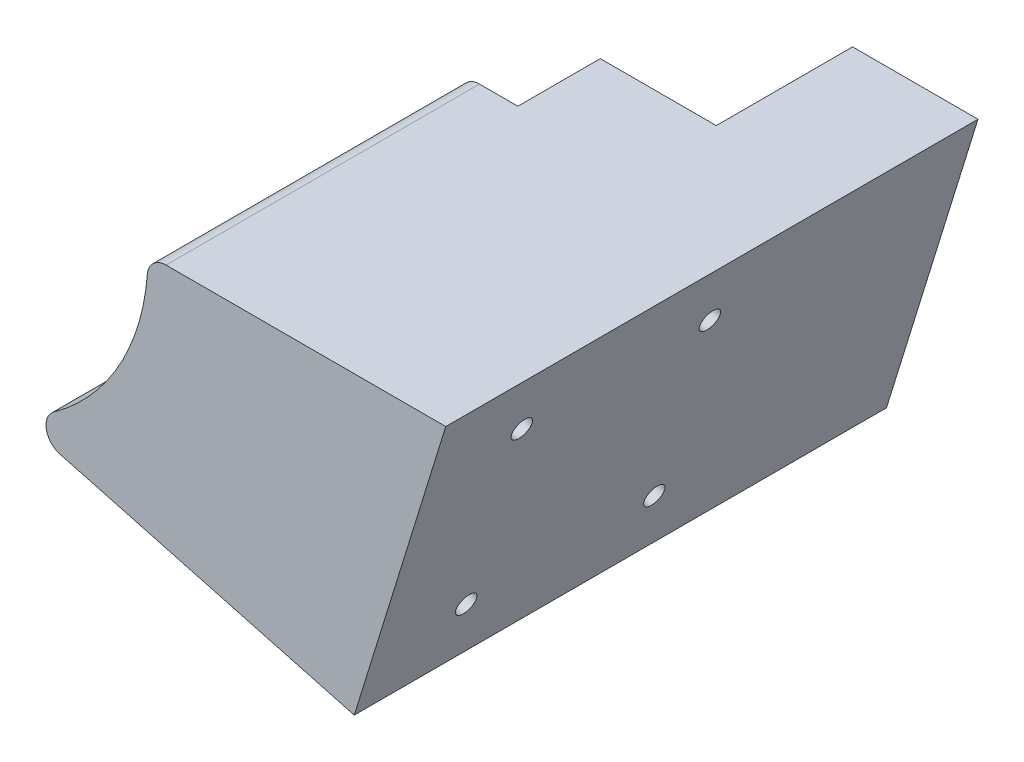
ISO-10303-21;
HEADER;
FILE_DESCRIPTION(('STEP AP214'),'2;1');
FILE_NAME('part.step','',(''),(''),'','','');
FILE_SCHEMA(('AUTOMOTIVE_DESIGN { 1 0 10303 214 1 1 1 1 }'));
ENDSEC;
DATA;
#1=APPLICATION_CONTEXT('core data for automotive mechanical design processes');
#2=APPLICATION_PROTOCOL_DEFINITION('international standard','automotive_design',2000,#1);
#3=PRODUCT_CONTEXT('',#1,'mechanical');
#4=PRODUCT('Part','Part','',(#3));
#5=PRODUCT_RELATED_PRODUCT_CATEGORY('part','',(#4));
#6=PRODUCT_DEFINITION_FORMATION('','',#4);
#7=PRODUCT_DEFINITION_CONTEXT('part definition',#1,'design');
#8=PRODUCT_DEFINITION('design','',#6,#7);
#9=PRODUCT_DEFINITION_SHAPE('','',#8);
#10=(LENGTH_UNIT() NAMED_UNIT(*) SI_UNIT(.MILLI.,.METRE.));
#11=(NAMED_UNIT(*) PLANE_ANGLE_UNIT() SI_UNIT($,.RADIAN.));
#12=(NAMED_UNIT(*) SI_UNIT($,.STERADIAN.) SOLID_ANGLE_UNIT());
#13=UNCERTAINTY_MEASURE_WITH_UNIT(LENGTH_MEASURE(1.E-05),#10,'distance_accuracy_value','');
#14=(GEOMETRIC_REPRESENTATION_CONTEXT(3) GLOBAL_UNCERTAINTY_ASSIGNED_CONTEXT((#13)) GLOBAL_UNIT_ASSIGNED_CONTEXT((#10,
#11,#12)) REPRESENTATION_CONTEXT('',''));
#15=CARTESIAN_POINT('',(0.,0.,0.));
#16=DIRECTION('',(0.,0.,1.));
#17=DIRECTION('',(1.,0.,0.));
#18=AXIS2_PLACEMENT_3D('',#15,#16,#17);
#19=CARTESIAN_POINT('',(0.,0.,0.));
#20=DIRECTION('',(0.,0.,-1.));
#21=DIRECTION('',(-1.,0.,0.));
#22=AXIS2_PLACEMENT_3D('',#19,#20,#21);
#23=PLANE('',#22);
#24=CARTESIAN_POINT('',(0.,0.,0.));
#25=DIRECTION('',(0.,0.,-1.));
#26=DIRECTION('',(-1.,0.,0.));
#27=AXIS2_PLACEMENT_3D('',#24,#25,#26);
#28=CIRCLE('',#27,36.);
#29=CARTESIAN_POINT('',(35.8933330988743,-2.76923076923077,0.));
#30=VERTEX_POINT('',#29);
#31=CARTESIAN_POINT('',(20.981426673297,-29.2537131788951,0.));
#32=VERTEX_POINT('',#31);
#33=EDGE_CURVE('E269',#30,#32,#28,.T.);
#34=ORIENTED_EDGE('',*,*,#33,.F.);
#35=CARTESIAN_POINT('',(38.8844441904472,-3.,0.));
#36=DIRECTION('',(0.,0.,-1.));
#37=DIRECTION('',(-1.,0.,0.));
#38=AXIS2_PLACEMENT_3D('',#35,#36,#37);
#39=CIRCLE('',#38,3.);
#40=CARTESIAN_POINT('',(38.8844441904472,0.,0.));
#41=VERTEX_POINT('',#40);
#42=EDGE_CURVE('E292',#30,#41,#39,.T.);
#43=ORIENTED_EDGE('',*,*,#42,.T.);
#44=DIRECTION('',(-1.,0.,0.));
#45=VECTOR('',#44,1.);
#46=CARTESIAN_POINT('',(36.,0.,0.));
#47=LINE('',#46,#45);
#48=CARTESIAN_POINT('',(45.,0.,0.));
#49=VERTEX_POINT('',#48);
#50=EDGE_CURVE('E274',#49,#41,#47,.T.);
#51=ORIENTED_EDGE('',*,*,#50,.F.);
#52=CARTESIAN_POINT('',(0.,0.,0.));
#53=DIRECTION('',(0.,0.,1.));
#54=DIRECTION('',(-1.,0.,0.));
#55=AXIS2_PLACEMENT_3D('',#52,#53,#54);
#56=CIRCLE('',#55,45.);
#57=CARTESIAN_POINT('',(27.0573720481867,-35.9568994470603,0.));
#58=VERTEX_POINT('',#57);
#59=EDGE_CURVE('E248',#58,#49,#56,.T.);
#60=ORIENTED_EDGE('',*,*,#59,.F.);
#61=DIRECTION('',(0.96592582628907,-0.258819045102514,0.));
#62=VECTOR('',#61,1.);
#63=CARTESIAN_POINT('',(-7.17672461435993,-26.7839008927221,0.));
#64=LINE('',#63,#62);
#65=CARTESIAN_POINT('',(21.9534217607643,-34.5893000893369,0.));
#66=VERTEX_POINT('',#65);
#67=EDGE_CURVE('E233',#66,#58,#64,.T.);
#68=ORIENTED_EDGE('',*,*,#67,.F.);
#69=CARTESIAN_POINT('',(22.7298788960718,-31.6915226104697,0.));
#70=DIRECTION('',(0.,0.,-1.));
#71=DIRECTION('',(-1.,0.,0.));
#72=AXIS2_PLACEMENT_3D('',#69,#70,#71);
#73=CIRCLE('',#72,3.);
#74=EDGE_CURVE('E289',#66,#32,#73,.T.);
#75=ORIENTED_EDGE('',*,*,#74,.T.);
#76=EDGE_LOOP('',(#34,#43,#51,#60,#68,#75));
#77=FACE_BOUND('',#76,.T.);
#78=ADVANCED_FACE('F49',(#77),#23,.T.);
#79=CARTESIAN_POINT('',(0.,0.,50.));
#80=DIRECTION('',(0.,0.,-1.));
#81=DIRECTION('',(-1.,0.,0.));
#82=AXIS2_PLACEMENT_3D('',#79,#80,#81);
#83=CYLINDRICAL_SURFACE('',#82,36.);
#84=CARTESIAN_POINT('',(0.,0.,50.));
#85=DIRECTION('',(0.,0.,-1.));
#86=DIRECTION('',(-1.,0.,0.));
#87=AXIS2_PLACEMENT_3D('',#84,#85,#86);
#88=CIRCLE('',#87,36.);
#89=CARTESIAN_POINT('',(35.8933330988743,-2.76923076923077,50.));
#90=VERTEX_POINT('',#89);
#91=CARTESIAN_POINT('',(20.981426673297,-29.2537131788951,50.));
#92=VERTEX_POINT('',#91);
#93=EDGE_CURVE('E270',#90,#92,#88,.T.);
#94=ORIENTED_EDGE('',*,*,#93,.F.);
#95=DIRECTION('',(0.,0.,-1.));
#96=VECTOR('',#95,1.);
#97=CARTESIAN_POINT('',(35.8933330988743,-2.76923076923077,50.));
#98=LINE('',#97,#96);
#99=EDGE_CURVE('E285',#90,#30,#98,.T.);
#100=ORIENTED_EDGE('',*,*,#99,.T.);
#101=ORIENTED_EDGE('',*,*,#33,.T.);
#102=DIRECTION('',(0.,0.,-1.));
#103=VECTOR('',#102,1.);
#104=CARTESIAN_POINT('',(20.9814266732971,-29.2537131788951,50.));
#105=LINE('',#104,#103);
#106=EDGE_CURVE('E277',#32,#92,#105,.F.);
#107=ORIENTED_EDGE('',*,*,#106,.T.);
#108=EDGE_LOOP('',(#94,#100,#101,#107));
#109=FACE_BOUND('',#108,.T.);
#110=ADVANCED_FACE('F306',(#109),#83,.F.);
#111=CARTESIAN_POINT('',(36.,0.,50.));
#112=DIRECTION('',(0.,-1.,0.));
#113=DIRECTION('',(0.,0.,-1.));
#114=AXIS2_PLACEMENT_3D('',#111,#112,#113);
#115=PLANE('',#114);
#116=ORIENTED_EDGE('',*,*,#50,.T.);
#117=DIRECTION('',(0.,0.,-1.));
#118=VECTOR('',#117,1.);
#119=CARTESIAN_POINT('',(38.8844441904472,0.,50.));
#120=LINE('',#119,#118);
#121=CARTESIAN_POINT('',(38.8844441904472,0.,50.));
#122=VERTEX_POINT('',#121);
#123=EDGE_CURVE('E78',#41,#122,#120,.F.);
#124=ORIENTED_EDGE('',*,*,#123,.T.);
#125=DIRECTION('',(-1.,0.,0.));
#126=VECTOR('',#125,1.);
#127=CARTESIAN_POINT('',(36.,0.,50.));
#128=LINE('',#127,#126);
#129=CARTESIAN_POINT('',(83.5,0.,50.));
#130=VERTEX_POINT('',#129);
#131=EDGE_CURVE('E273',#130,#122,#128,.T.);
#132=ORIENTED_EDGE('',*,*,#131,.F.);
#133=DIRECTION('',(0.,0.,-1.));
#134=VECTOR('',#133,1.);
#135=CARTESIAN_POINT('',(83.5,0.,156.955598263953));
#136=LINE('',#135,#134);
#137=CARTESIAN_POINT('',(83.5,0.,-34.9));
#138=VERTEX_POINT('',#137);
#139=EDGE_CURVE('E244',#130,#138,#136,.T.);
#140=ORIENTED_EDGE('',*,*,#139,.T.);
#141=DIRECTION('',(1.,0.,0.));
#142=VECTOR('',#141,1.);
#143=CARTESIAN_POINT('',(63.5,0.,-34.9));
#144=LINE('',#143,#142);
#145=CARTESIAN_POINT('',(63.5,0.,-34.9));
#146=VERTEX_POINT('',#145);
#147=EDGE_CURVE('E239',#146,#138,#144,.T.);
#148=ORIENTED_EDGE('',*,*,#147,.F.);
#149=DIRECTION('',(0.,0.,-1.));
#150=VECTOR('',#149,1.);
#151=CARTESIAN_POINT('',(63.5,0.,156.955598263953));
#152=LINE('',#151,#150);
#153=CARTESIAN_POINT('',(63.5,0.,-13.15));
#154=VERTEX_POINT('',#153);
#155=EDGE_CURVE('E243',#154,#146,#152,.T.);
#156=ORIENTED_EDGE('',*,*,#155,.F.);
#157=DIRECTION('',(1.,0.,0.));
#158=VECTOR('',#157,1.);
#159=CARTESIAN_POINT('',(45.,0.,-13.15));
#160=LINE('',#159,#158);
#161=CARTESIAN_POINT('',(45.,0.,-13.15));
#162=VERTEX_POINT('',#161);
#163=EDGE_CURVE('E255',#162,#154,#160,.T.);
#164=ORIENTED_EDGE('',*,*,#163,.F.);
#165=DIRECTION('',(0.,0.,1.));
#166=VECTOR('',#165,1.);
#167=CARTESIAN_POINT('',(45.,0.,-13.15));
#168=LINE('',#167,#166);
#169=EDGE_CURVE('E263',#162,#49,#168,.T.);
#170=ORIENTED_EDGE('',*,*,#169,.T.);
#171=EDGE_LOOP('',(#116,#124,#132,#140,#148,#156,#164,#170));
#172=FACE_BOUND('',#171,.T.);
#173=ADVANCED_FACE('F313',(#172),#115,.F.);
#174=CARTESIAN_POINT('',(0.,0.,50.));
#175=DIRECTION('',(0.,0.,-1.));
#176=DIRECTION('',(-1.,0.,0.));
#177=AXIS2_PLACEMENT_3D('',#174,#175,#176);
#178=PLANE('',#177);
#179=DIRECTION('',(-0.96592582628907,0.258819045102514,0.));
#180=VECTOR('',#179,1.);
#181=CARTESIAN_POINT('',(15.,-32.7261363439071,50.));
#182=LINE('',#181,#180);
#183=CARTESIAN_POINT('',(68.901001848363,-47.1688662604041,50.));
#184=VERTEX_POINT('',#183);
#185=CARTESIAN_POINT('',(21.9534217607643,-34.5893000893369,50.));
#186=VERTEX_POINT('',#185);
#187=EDGE_CURVE('E210',#184,#186,#182,.T.);
#188=ORIENTED_EDGE('',*,*,#187,.F.);
#189=DIRECTION('',(-0.29566729715781,-0.955290976295388,0.));
#190=VECTOR('',#189,1.);
#191=CARTESIAN_POINT('',(83.5,0.,50.));
#192=LINE('',#191,#190);
#193=EDGE_CURVE('E205',#130,#184,#192,.T.);
#194=ORIENTED_EDGE('',*,*,#193,.F.);
#195=ORIENTED_EDGE('',*,*,#131,.T.);
#196=CARTESIAN_POINT('',(38.8844441904472,-3.,50.));
#197=DIRECTION('',(0.,0.,-1.));
#198=DIRECTION('',(-1.,0.,0.));
#199=AXIS2_PLACEMENT_3D('',#196,#197,#198);
#200=CIRCLE('',#199,3.);
#201=EDGE_CURVE('E58',#122,#90,#200,.F.);
#202=ORIENTED_EDGE('',*,*,#201,.T.);
#203=ORIENTED_EDGE('',*,*,#93,.T.);
#204=CARTESIAN_POINT('',(22.7298788960718,-31.6915226104697,50.));
#205=DIRECTION('',(0.,0.,-1.));
#206=DIRECTION('',(-1.,0.,0.));
#207=AXIS2_PLACEMENT_3D('',#204,#205,#206);
#208=CIRCLE('',#207,3.);
#209=EDGE_CURVE('E68',#92,#186,#208,.F.);
#210=ORIENTED_EDGE('',*,*,#209,.T.);
#211=EDGE_LOOP('',(#188,#194,#195,#202,#203,#210));
#212=FACE_BOUND('',#211,.T.);
#213=ADVANCED_FACE('F301',(#212),#178,.F.);
#214=CARTESIAN_POINT('',(0.,0.,-13.15));
#215=DIRECTION('',(0.,0.,1.));
#216=DIRECTION('',(1.,0.,0.));
#217=AXIS2_PLACEMENT_3D('',#214,#215,#216);
#218=CYLINDRICAL_SURFACE('',#217,45.);
#219=CARTESIAN_POINT('',(0.,0.,-13.15));
#220=DIRECTION('',(0.,0.,1.));
#221=DIRECTION('',(-1.,0.,0.));
#222=AXIS2_PLACEMENT_3D('',#219,#220,#221);
#223=CIRCLE('',#222,45.);
#224=CARTESIAN_POINT('',(27.0573720481867,-35.9568994470603,-13.15));
#225=VERTEX_POINT('',#224);
#226=EDGE_CURVE('E252',#225,#162,#223,.T.);
#227=ORIENTED_EDGE('',*,*,#226,.F.);
#228=DIRECTION('',(0.,0.,1.));
#229=VECTOR('',#228,1.);
#230=CARTESIAN_POINT('',(27.0573720481867,-35.9568994470603,-13.15));
#231=LINE('',#230,#229);
#232=EDGE_CURVE('E229',#225,#58,#231,.T.);
#233=ORIENTED_EDGE('',*,*,#232,.T.);
#234=ORIENTED_EDGE('',*,*,#59,.T.);
#235=ORIENTED_EDGE('',*,*,#169,.F.);
#236=EDGE_LOOP('',(#227,#233,#234,#235));
#237=FACE_BOUND('',#236,.T.);
#238=ADVANCED_FACE('F319',(#237),#218,.F.);
#239=CARTESIAN_POINT('',(0.,0.,-13.15));
#240=DIRECTION('',(0.,0.,-1.));
#241=DIRECTION('',(-1.,0.,0.));
#242=AXIS2_PLACEMENT_3D('',#239,#240,#241);
#243=PLANE('',#242);
#244=DIRECTION('',(0.96592582628907,-0.258819045102514,0.));
#245=VECTOR('',#244,1.);
#246=CARTESIAN_POINT('',(-7.17672461435993,-26.7839008927221,-13.15));
#247=LINE('',#246,#245);
#248=CARTESIAN_POINT('',(48.0026476199611,-41.5691691217644,-13.15));
#249=VERTEX_POINT('',#248);
#250=EDGE_CURVE('E226',#225,#249,#247,.T.);
#251=ORIENTED_EDGE('',*,*,#250,.F.);
#252=ORIENTED_EDGE('',*,*,#226,.T.);
#253=ORIENTED_EDGE('',*,*,#163,.T.);
#254=CARTESIAN_POINT('',(0.,0.,-13.15));
#255=DIRECTION('',(0.,0.,-1.));
#256=DIRECTION('',(-1.,0.,0.));
#257=AXIS2_PLACEMENT_3D('',#254,#255,#256);
#258=CIRCLE('',#257,63.5);
#259=EDGE_CURVE('E259',#154,#249,#258,.T.);
#260=ORIENTED_EDGE('',*,*,#259,.T.);
#261=EDGE_LOOP('',(#251,#252,#253,#260));
#262=FACE_BOUND('',#261,.T.);
#263=ADVANCED_FACE('F353',(#262),#243,.T.);
#264=CARTESIAN_POINT('',(0.,0.,156.955598263953));
#265=DIRECTION('',(0.,0.,-1.));
#266=DIRECTION('',(-1.,0.,0.));
#267=AXIS2_PLACEMENT_3D('',#264,#265,#266);
#268=CYLINDRICAL_SURFACE('',#267,63.5);
#269=DIRECTION('',(0.,0.,-1.));
#270=VECTOR('',#269,1.);
#271=CARTESIAN_POINT('',(48.0026476199611,-41.5691691217644,156.955598263953));
#272=LINE('',#271,#270);
#273=CARTESIAN_POINT('',(48.0026476199611,-41.5691691217644,-34.9));
#274=VERTEX_POINT('',#273);
#275=EDGE_CURVE('E223',#249,#274,#272,.T.);
#276=ORIENTED_EDGE('',*,*,#275,.F.);
#277=ORIENTED_EDGE('',*,*,#259,.F.);
#278=ORIENTED_EDGE('',*,*,#155,.T.);
#279=CARTESIAN_POINT('',(0.,0.,-34.9));
#280=DIRECTION('',(0.,0.,1.));
#281=DIRECTION('',(-1.,0.,0.));
#282=AXIS2_PLACEMENT_3D('',#279,#280,#281);
#283=CIRCLE('',#282,63.5);
#284=EDGE_CURVE('E236',#274,#146,#283,.T.);
#285=ORIENTED_EDGE('',*,*,#284,.F.);
#286=EDGE_LOOP('',(#276,#277,#278,#285));
#287=FACE_BOUND('',#286,.T.);
#288=ADVANCED_FACE('F357',(#287),#268,.F.);
#289=CARTESIAN_POINT('',(0.,0.,-34.9));
#290=DIRECTION('',(0.,0.,-1.));
#291=DIRECTION('',(-1.,0.,0.));
#292=AXIS2_PLACEMENT_3D('',#289,#290,#291);
#293=PLANE('',#292);
#294=DIRECTION('',(-0.29566729715781,-0.955290976295388,0.));
#295=VECTOR('',#294,1.);
#296=CARTESIAN_POINT('',(83.5,0.,-34.9));
#297=LINE('',#296,#295);
#298=CARTESIAN_POINT('',(68.901001848363,-47.1688662604041,-34.9));
#299=VERTEX_POINT('',#298);
#300=EDGE_CURVE('E206',#138,#299,#297,.T.);
#301=ORIENTED_EDGE('',*,*,#300,.T.);
#302=DIRECTION('',(-0.96592582628907,0.258819045102514,0.));
#303=VECTOR('',#302,1.);
#304=CARTESIAN_POINT('',(15.,-32.7261363439071,-34.9));
#305=LINE('',#304,#303);
#306=EDGE_CURVE('E213',#299,#274,#305,.T.);
#307=ORIENTED_EDGE('',*,*,#306,.T.);
#308=ORIENTED_EDGE('',*,*,#284,.T.);
#309=ORIENTED_EDGE('',*,*,#147,.T.);
#310=EDGE_LOOP('',(#301,#307,#308,#309));
#311=FACE_BOUND('',#310,.T.);
#312=ADVANCED_FACE('F362',(#311),#293,.T.);
#313=CARTESIAN_POINT('',(15.,-32.7261363439071,-34.9));
#314=DIRECTION('',(0.258819045102514,0.96592582628907,0.));
#315=DIRECTION('',(-0.96592582628907,0.258819045102514,0.));
#316=AXIS2_PLACEMENT_3D('',#313,#314,#315);
#317=PLANE('',#316);
#318=ORIENTED_EDGE('',*,*,#187,.T.);
#319=DIRECTION('',(0.,0.,-1.));
#320=VECTOR('',#319,1.);
#321=CARTESIAN_POINT('',(21.9534217607643,-34.5893000893369,-34.9));
#322=LINE('',#321,#320);
#323=EDGE_CURVE('E11',#186,#66,#322,.T.);
#324=ORIENTED_EDGE('',*,*,#323,.T.);
#325=ORIENTED_EDGE('',*,*,#67,.T.);
#326=ORIENTED_EDGE('',*,*,#232,.F.);
#327=ORIENTED_EDGE('',*,*,#250,.T.);
#328=ORIENTED_EDGE('',*,*,#275,.T.);
#329=ORIENTED_EDGE('',*,*,#306,.F.);
#330=DIRECTION('',(0.,0.,1.));
#331=VECTOR('',#330,1.);
#332=CARTESIAN_POINT('',(68.901001848363,-47.1688662604041,-34.9));
#333=LINE('',#332,#331);
#334=EDGE_CURVE('E217',#299,#184,#333,.T.);
#335=ORIENTED_EDGE('',*,*,#334,.T.);
#336=EDGE_LOOP('',(#318,#324,#325,#326,#327,#328,#329,#335));
#337=FACE_BOUND('',#336,.T.);
#338=ADVANCED_FACE('F322',(#337),#317,.F.);
#339=CARTESIAN_POINT('',(38.8844441904472,-3.,50.));
#340=DIRECTION('',(0.,0.,-1.));
#341=DIRECTION('',(-1.,0.,0.));
#342=AXIS2_PLACEMENT_3D('',#339,#340,#341);
#343=CYLINDRICAL_SURFACE('',#342,3.);
#344=ORIENTED_EDGE('',*,*,#201,.F.);
#345=ORIENTED_EDGE('',*,*,#123,.F.);
#346=ORIENTED_EDGE('',*,*,#42,.F.);
#347=ORIENTED_EDGE('',*,*,#99,.F.);
#348=EDGE_LOOP('',(#344,#345,#346,#347));
#349=FACE_BOUND('',#348,.T.);
#350=ADVANCED_FACE('F309',(#349),#343,.T.);
#351=CARTESIAN_POINT('',(22.7298788960718,-31.6915226104697,50.));
#352=DIRECTION('',(0.,0.,-1.));
#353=DIRECTION('',(-1.,0.,0.));
#354=AXIS2_PLACEMENT_3D('',#351,#352,#353);
#355=CYLINDRICAL_SURFACE('',#354,3.);
#356=ORIENTED_EDGE('',*,*,#209,.F.);
#357=ORIENTED_EDGE('',*,*,#106,.F.);
#358=ORIENTED_EDGE('',*,*,#74,.F.);
#359=ORIENTED_EDGE('',*,*,#323,.F.);
#360=EDGE_LOOP('',(#356,#357,#358,#359));
#361=FACE_BOUND('',#360,.T.);
#362=ADVANCED_FACE('F51',(#361),#355,.T.);
#363=CARTESIAN_POINT('',(83.5,0.,-34.9));
#364=DIRECTION('',(-0.955290976295388,0.29566729715781,0.));
#365=DIRECTION('',(-0.29566729715781,-0.955290976295388,0.));
#366=AXIS2_PLACEMENT_3D('',#363,#364,#365);
#367=PLANE('',#366);
#368=CARTESIAN_POINT('',(80.6355103815487,-9.25506848577122,35.));
#369=DIRECTION('',(0.955290976295388,-0.295667297157811,0.));
#370=DIRECTION('',(0.295667297157811,0.955290976295388,0.));
#371=AXIS2_PLACEMENT_3D('',#368,#369,#370);
#372=CIRCLE('',#371,1.64999999999999);
#373=CARTESIAN_POINT('',(81.1233614218591,-7.67883837488383,35.));
#374=VERTEX_POINT('',#373);
#375=EDGE_CURVE('E176',#374,#374,#372,.T.);
#376=ORIENTED_EDGE('',*,*,#375,.F.);
#377=EDGE_LOOP('',(#376));
#378=FACE_BOUND('',#377,.T.);
#379=CARTESIAN_POINT('',(71.7654914668144,-37.9137977746328,35.));
#380=DIRECTION('',(0.955290976295388,-0.295667297157811,0.));
#381=DIRECTION('',(0.295667297157811,0.955290976295388,0.));
#382=AXIS2_PLACEMENT_3D('',#379,#380,#381);
#383=CIRCLE('',#382,1.64999999999999);
#384=CARTESIAN_POINT('',(72.2533425071247,-36.3375676637455,35.));
#385=VERTEX_POINT('',#384);
#386=EDGE_CURVE('E175',#385,#385,#383,.T.);
#387=ORIENTED_EDGE('',*,*,#386,.F.);
#388=EDGE_LOOP('',(#387));
#389=FACE_BOUND('',#388,.T.);
#390=CARTESIAN_POINT('',(80.6355103815487,-9.25506848577122,5.));
#391=DIRECTION('',(0.955290976295388,-0.295667297157811,0.));
#392=DIRECTION('',(0.295667297157811,0.955290976295388,0.));
#393=AXIS2_PLACEMENT_3D('',#390,#391,#392);
#394=CIRCLE('',#393,1.64999999999999);
#395=CARTESIAN_POINT('',(81.1233614218591,-7.67883837488383,5.));
#396=VERTEX_POINT('',#395);
#397=EDGE_CURVE('E191',#396,#396,#394,.T.);
#398=ORIENTED_EDGE('',*,*,#397,.F.);
#399=EDGE_LOOP('',(#398));
#400=FACE_BOUND('',#399,.T.);
#401=CARTESIAN_POINT('',(71.7654914668144,-37.9137977746328,5.));
#402=DIRECTION('',(0.955290976295388,-0.295667297157811,0.));
#403=DIRECTION('',(0.295667297157811,0.955290976295388,0.));
#404=AXIS2_PLACEMENT_3D('',#401,#402,#403);
#405=CIRCLE('',#404,1.64999999999999);
#406=CARTESIAN_POINT('',(72.2533425071247,-36.3375676637455,5.));
#407=VERTEX_POINT('',#406);
#408=EDGE_CURVE('E198',#407,#407,#405,.T.);
#409=ORIENTED_EDGE('',*,*,#408,.F.);
#410=EDGE_LOOP('',(#409));
#411=FACE_BOUND('',#410,.T.);
#412=ORIENTED_EDGE('',*,*,#193,.T.);
#413=ORIENTED_EDGE('',*,*,#334,.F.);
#414=ORIENTED_EDGE('',*,*,#300,.F.);
#415=ORIENTED_EDGE('',*,*,#139,.F.);
#416=EDGE_LOOP('',(#412,#413,#414,#415));
#417=FACE_BOUND('',#416,.T.);
#418=ADVANCED_FACE('F327',(#378,#389,#400,#411,#417),#367,.F.);
#419=CARTESIAN_POINT('',(62.2125817038605,-34.9571248030547,5.));
#420=DIRECTION('',(0.955290976295388,-0.295667297157811,0.));
#421=DIRECTION('',(0.295667297157811,0.955290976295388,0.));
#422=AXIS2_PLACEMENT_3D('',#419,#420,#421);
#423=CONICAL_SURFACE('',#422,1.64999999999999,1.02974425867665);
#424=CARTESIAN_POINT('',(61.2654871037028,-34.6639943249806,5.));
#425=VERTEX_POINT('',#424);
#426=VERTEX_LOOP('',#425);
#427=FACE_BOUND('',#426,.T.);
#428=CARTESIAN_POINT('',(62.2125817038605,-34.9571248030547,5.));
#429=DIRECTION('',(0.955290976295388,-0.295667297157811,0.));
#430=DIRECTION('',(0.295667297157811,0.955290976295388,0.));
#431=AXIS2_PLACEMENT_3D('',#428,#429,#430);
#432=CIRCLE('',#431,1.64999999999999);
#433=CARTESIAN_POINT('',(62.7004327441709,-33.3808946921674,5.));
#434=VERTEX_POINT('',#433);
#435=EDGE_CURVE('E201',#434,#434,#432,.T.);
#436=ORIENTED_EDGE('',*,*,#435,.T.);
#437=EDGE_LOOP('',(#436));
#438=FACE_BOUND('',#437,.T.);
#439=ADVANCED_FACE('F332',(#427,#438),#423,.F.);
#440=CARTESIAN_POINT('',(71.7654914668144,-37.9137977746328,5.));
#441=DIRECTION('',(0.955290976295388,-0.295667297157811,0.));
#442=DIRECTION('',(0.295667297157811,0.955290976295388,0.));
#443=AXIS2_PLACEMENT_3D('',#440,#441,#442);
#444=CYLINDRICAL_SURFACE('',#443,1.64999999999999);
#445=CARTESIAN_POINT('',(62.7004327441709,-33.3808946921674,5.));
#446=CARTESIAN_POINT('',(62.7999422208683,-33.4116933689546,5.));
#447=CARTESIAN_POINT('',(62.8994516975657,-33.4424920457419,5.));
#448=CARTESIAN_POINT('',(63.0984706509606,-33.5040893993164,5.));
#449=CARTESIAN_POINT('',(63.197980127658,-33.5348880761037,5.));
#450=CARTESIAN_POINT('',(63.3969990810529,-33.5964854296783,5.));
#451=CARTESIAN_POINT('',(63.4965085577504,-33.6272841064655,5.));
#452=CARTESIAN_POINT('',(63.6955275111452,-33.6888814600401,5.));
#453=CARTESIAN_POINT('',(63.7950369878427,-33.7196801368273,5.));
#454=CARTESIAN_POINT('',(63.9940559412375,-33.7812774904019,5.));
#455=CARTESIAN_POINT('',(64.093565417935,-33.8120761671892,5.));
#456=CARTESIAN_POINT('',(64.2925843713299,-33.8736735207637,5.));
#457=CARTESIAN_POINT('',(64.3920938480273,-33.904472197551,5.));
#458=CARTESIAN_POINT('',(64.5911128014222,-33.9660695511255,5.));
#459=CARTESIAN_POINT('',(64.6906222781196,-33.9968682279128,5.));
#460=CARTESIAN_POINT('',(64.8896412315145,-34.0584655814873,5.));
#461=CARTESIAN_POINT('',(64.9891507082119,-34.0892642582746,5.));
#462=CARTESIAN_POINT('',(65.1881696616068,-34.1508616118492,5.));
#463=CARTESIAN_POINT('',(65.2876791383042,-34.1816602886364,5.));
#464=CARTESIAN_POINT('',(65.4866980916991,-34.243257642211,5.));
#465=CARTESIAN_POINT('',(65.5862075683965,-34.2740563189982,5.));
#466=CARTESIAN_POINT('',(65.7852265217914,-34.3356536725728,5.));
#467=CARTESIAN_POINT('',(65.8847359984888,-34.3664523493601,5.));
#468=CARTESIAN_POINT('',(66.0837549518837,-34.4280497029346,5.));
#469=CARTESIAN_POINT('',(66.1832644285811,-34.4588483797219,5.));
#470=CARTESIAN_POINT('',(66.382283381976,-34.5204457332964,5.));
#471=CARTESIAN_POINT('',(66.4817928586734,-34.5512444100837,5.));
#472=CARTESIAN_POINT('',(66.6808118120683,-34.6128417636582,5.));
#473=CARTESIAN_POINT('',(66.7803212887657,-34.6436404404455,5.));
#474=CARTESIAN_POINT('',(66.9793402421606,-34.7052377940201,5.));
#475=CARTESIAN_POINT('',(67.0788497188581,-34.7360364708073,5.));
#476=CARTESIAN_POINT('',(67.2778686722529,-34.7976338243819,5.));
#477=CARTESIAN_POINT('',(67.3773781489504,-34.8284325011691,5.));
#478=CARTESIAN_POINT('',(67.5763971023452,-34.8900298547437,5.));
#479=CARTESIAN_POINT('',(67.6759065790427,-34.920828531531,5.));
#480=CARTESIAN_POINT('',(67.8749255324376,-34.9824258851055,5.));
#481=CARTESIAN_POINT('',(67.974435009135,-35.0132245618928,5.));
#482=CARTESIAN_POINT('',(68.1734539625299,-35.0748219154673,5.));
#483=CARTESIAN_POINT('',(68.2729634392273,-35.1056205922546,5.));
#484=CARTESIAN_POINT('',(68.4719823926222,-35.1672179458291,5.));
#485=CARTESIAN_POINT('',(68.5714918693196,-35.1980166226164,5.));
#486=CARTESIAN_POINT('',(68.7705108227145,-35.2596139761909,5.));
#487=CARTESIAN_POINT('',(68.8700202994119,-35.2904126529782,5.));
#488=CARTESIAN_POINT('',(69.0690392528068,-35.3520100065528,5.));
#489=CARTESIAN_POINT('',(69.1685487295042,-35.38280868334,5.));
#490=CARTESIAN_POINT('',(69.3675676828991,-35.4444060369146,5.));
#491=CARTESIAN_POINT('',(69.4670771595965,-35.4752047137018,5.));
#492=CARTESIAN_POINT('',(69.6660961129914,-35.5368020672764,5.));
#493=CARTESIAN_POINT('',(69.7656055896888,-35.5676007440637,5.));
#494=CARTESIAN_POINT('',(69.9646245430837,-35.6291980976382,5.));
#495=CARTESIAN_POINT('',(70.0641340197812,-35.6599967744255,5.));
#496=CARTESIAN_POINT('',(70.263152973176,-35.721594128,5.));
#497=CARTESIAN_POINT('',(70.3626624498735,-35.7523928047873,5.));
#498=CARTESIAN_POINT('',(70.5616814032683,-35.8139901583618,5.));
#499=CARTESIAN_POINT('',(70.6611908799658,-35.8447888351491,5.));
#500=CARTESIAN_POINT('',(70.8602098333606,-35.9063861887237,5.));
#501=CARTESIAN_POINT('',(70.9597193100581,-35.9371848655109,5.));
#502=CARTESIAN_POINT('',(71.1587382634529,-35.9987822190855,5.));
#503=CARTESIAN_POINT('',(71.2582477401504,-36.0295808958727,5.));
#504=CARTESIAN_POINT('',(71.4572666935453,-36.0911782494473,5.));
#505=CARTESIAN_POINT('',(71.5567761702427,-36.1219769262346,5.));
#506=CARTESIAN_POINT('',(71.7557951236376,-36.1835742798091,5.));
#507=CARTESIAN_POINT('',(71.855304600335,-36.2143729565964,5.));
#508=CARTESIAN_POINT('',(72.0543235537299,-36.2759703101709,5.));
#509=CARTESIAN_POINT('',(72.1538330304273,-36.3067689869582,5.));
#510=CARTESIAN_POINT('',(72.2533425071247,-36.3375676637455,5.));
#511=B_SPLINE_CURVE_WITH_KNOTS('',3,(#445,#446,#447,#448,#449,#450,#451,#452,#453,#454,#455,
#456,#457,#458,#459,#460,#461,#462,#463,#464,#465,#466,#467,#468,#469,#470,#471,#472,#473,#474,
#475,#476,#477,#478,#479,#480,#481,#482,#483,#484,#485,#486,#487,#488,#489,#490,#491,#492,#493,
#494,#495,#496,#497,#498,#499,#500,#501,#502,#503,#504,#505,#506,#507,#508,#509,#510),
.UNSPECIFIED.,.F.,.F.,(4,2,2,2,2,2,2,2,2,2,2,2,2,2,2,2,2,2,2,2,2,2,2,2,2,2,2,2,2,2,2,2,4),(0.,
0.312500000000007,0.625000000000012,0.937500000000006,1.25,1.56250000000001,1.87500000000001,
2.1875,2.50000000000001,2.8125,3.12500000000001,3.4375,3.75000000000001,4.0625,4.37500000000001,
4.6875,5.00000000000001,5.3125,5.62500000000001,5.9375,6.25,6.5625,6.875,7.1875,7.5,7.8125,
8.125,8.4375,8.75,9.0625,9.375,9.68749999999999,10.),.UNSPECIFIED.);
#512=EDGE_CURVE('BSEAM369',#434,#407,#511,.T.);
#513=ORIENTED_EDGE('',*,*,#435,.F.);
#514=ORIENTED_EDGE('',*,*,#408,.T.);
#515=ORIENTED_EDGE('',*,*,#512,.T.);
#516=ORIENTED_EDGE('',*,*,#512,.F.);
#517=EDGE_LOOP('',(#513,#515,#514,#516));
#518=FACE_BOUND('',#517,.T.);
#519=ADVANCED_FACE('F369',(#518),#444,.F.);
#520=CARTESIAN_POINT('',(71.0826006185948,-6.29839551419311,5.));
#521=DIRECTION('',(0.955290976295388,-0.295667297157811,0.));
#522=DIRECTION('',(0.295667297157811,0.955290976295388,0.));
#523=AXIS2_PLACEMENT_3D('',#520,#521,#522);
#524=CONICAL_SURFACE('',#523,1.64999999999999,1.02974425867665);
#525=CARTESIAN_POINT('',(70.1355060184371,-6.00526503611897,5.));
#526=VERTEX_POINT('',#525);
#527=VERTEX_LOOP('',#526);
#528=FACE_BOUND('',#527,.T.);
#529=CARTESIAN_POINT('',(71.0826006185948,-6.29839551419311,5.));
#530=DIRECTION('',(0.955290976295388,-0.295667297157811,0.));
#531=DIRECTION('',(0.295667297157811,0.955290976295388,0.));
#532=AXIS2_PLACEMENT_3D('',#529,#530,#531);
#533=CIRCLE('',#532,1.64999999999999);
#534=CARTESIAN_POINT('',(71.5704516589052,-4.72216540330573,5.));
#535=VERTEX_POINT('',#534);
#536=EDGE_CURVE('E194',#535,#535,#533,.T.);
#537=ORIENTED_EDGE('',*,*,#536,.T.);
#538=EDGE_LOOP('',(#537));
#539=FACE_BOUND('',#538,.T.);
#540=ADVANCED_FACE('F373',(#528,#539),#524,.F.);
#541=CARTESIAN_POINT('',(80.6355103815487,-9.25506848577122,5.));
#542=DIRECTION('',(0.955290976295388,-0.295667297157811,0.));
#543=DIRECTION('',(0.295667297157811,0.955290976295388,0.));
#544=AXIS2_PLACEMENT_3D('',#541,#542,#543);
#545=CYLINDRICAL_SURFACE('',#544,1.64999999999999);
#546=CARTESIAN_POINT('',(71.5704516589052,-4.72216540330573,5.));
#547=CARTESIAN_POINT('',(71.6699611356026,-4.75296408009301,5.));
#548=CARTESIAN_POINT('',(71.7694706123001,-4.78376275688028,5.));
#549=CARTESIAN_POINT('',(71.968489565695,-4.84536011045482,5.));
#550=CARTESIAN_POINT('',(72.0679990423924,-4.87615878724209,5.));
#551=CARTESIAN_POINT('',(72.2670179957872,-4.93775614081664,5.));
#552=CARTESIAN_POINT('',(72.3665274724847,-4.96855481760391,5.));
#553=CARTESIAN_POINT('',(72.5655464258795,-5.03015217117845,5.));
#554=CARTESIAN_POINT('',(72.665055902577,-5.06095084796572,5.));
#555=CARTESIAN_POINT('',(72.8640748559719,-5.12254820154027,5.));
#556=CARTESIAN_POINT('',(72.9635843326693,-5.15334687832754,5.));
#557=CARTESIAN_POINT('',(73.1626032860642,-5.21494423190208,5.));
#558=CARTESIAN_POINT('',(73.2621127627616,-5.24574290868935,5.));
#559=CARTESIAN_POINT('',(73.4611317161565,-5.3073402622639,5.));
#560=CARTESIAN_POINT('',(73.5606411928539,-5.33813893905117,5.));
#561=CARTESIAN_POINT('',(73.7596601462488,-5.39973629262571,5.));
#562=CARTESIAN_POINT('',(73.8591696229462,-5.43053496941299,5.));
#563=CARTESIAN_POINT('',(74.0581885763411,-5.49213232298753,5.));
#564=CARTESIAN_POINT('',(74.1576980530385,-5.5229309997748,5.));
#565=CARTESIAN_POINT('',(74.3567170064334,-5.58452835334935,5.));
#566=CARTESIAN_POINT('',(74.4562264831308,-5.61532703013662,5.));
#567=CARTESIAN_POINT('',(74.6552454365257,-5.67692438371116,5.));
#568=CARTESIAN_POINT('',(74.7547549132232,-5.70772306049843,5.));
#569=CARTESIAN_POINT('',(74.953773866618,-5.76932041407298,5.));
#570=CARTESIAN_POINT('',(75.0532833433155,-5.80011909086025,5.));
#571=CARTESIAN_POINT('',(75.2523022967103,-5.86171644443479,5.));
#572=CARTESIAN_POINT('',(75.3518117734078,-5.89251512122206,5.));
#573=CARTESIAN_POINT('',(75.5508307268026,-5.95411247479661,5.));
#574=CARTESIAN_POINT('',(75.6503402035001,-5.98491115158388,5.));
#575=CARTESIAN_POINT('',(75.8493591568949,-6.04650850515842,5.));
#576=CARTESIAN_POINT('',(75.9488686335924,-6.0773071819457,5.));
#577=CARTESIAN_POINT('',(76.1478875869873,-6.13890453552024,5.));
#578=CARTESIAN_POINT('',(76.2473970636847,-6.16970321230751,5.));
#579=CARTESIAN_POINT('',(76.4464160170796,-6.23130056588205,5.));
#580=CARTESIAN_POINT('',(76.545925493777,-6.26209924266933,5.));
#581=CARTESIAN_POINT('',(76.7449444471719,-6.32369659624387,5.));
#582=CARTESIAN_POINT('',(76.8444539238693,-6.35449527303114,5.));
#583=CARTESIAN_POINT('',(77.0434728772642,-6.41609262660569,5.));
#584=CARTESIAN_POINT('',(77.1429823539616,-6.44689130339296,5.));
#585=CARTESIAN_POINT('',(77.3420013073565,-6.5084886569675,5.));
#586=CARTESIAN_POINT('',(77.4415107840539,-6.53928733375477,5.));
#587=CARTESIAN_POINT('',(77.6405297374488,-6.60088468732932,5.));
#588=CARTESIAN_POINT('',(77.7400392141462,-6.63168336411659,5.));
#589=CARTESIAN_POINT('',(77.9390581675411,-6.69328071769113,5.));
#590=CARTESIAN_POINT('',(78.0385676442385,-6.7240793944784,5.));
#591=CARTESIAN_POINT('',(78.2375865976334,-6.78567674805295,5.));
#592=CARTESIAN_POINT('',(78.3370960743309,-6.81647542484022,5.));
#593=CARTESIAN_POINT('',(78.5361150277257,-6.87807277841477,5.));
#594=CARTESIAN_POINT('',(78.6356245044232,-6.90887145520204,5.));
#595=CARTESIAN_POINT('',(78.834643457818,-6.97046880877658,5.));
#596=CARTESIAN_POINT('',(78.9341529345155,-7.00126748556385,5.));
#597=CARTESIAN_POINT('',(79.1331718879104,-7.0628648391384,5.));
#598=CARTESIAN_POINT('',(79.2326813646078,-7.09366351592567,5.));
#599=CARTESIAN_POINT('',(79.4317003180026,-7.15526086950021,5.));
#600=CARTESIAN_POINT('',(79.5312097947001,-7.18605954628748,5.));
#601=CARTESIAN_POINT('',(79.730228748095,-7.24765689986203,5.));
#602=CARTESIAN_POINT('',(79.8297382247924,-7.2784555766493,5.));
#603=CARTESIAN_POINT('',(80.0287571781873,-7.34005293022384,5.));
#604=CARTESIAN_POINT('',(80.1282666548847,-7.37085160701112,5.));
#605=CARTESIAN_POINT('',(80.3272856082796,-7.43244896058566,5.));
#606=CARTESIAN_POINT('',(80.426795084977,-7.46324763737293,5.));
#607=CARTESIAN_POINT('',(80.6258140383719,-7.52484499094747,5.));
#608=CARTESIAN_POINT('',(80.7253235150693,-7.55564366773475,5.));
#609=CARTESIAN_POINT('',(80.9243424684642,-7.61724102130929,5.));
#610=CARTESIAN_POINT('',(81.0238519451616,-7.64803969809656,5.));
#611=CARTESIAN_POINT('',(81.1233614218591,-7.67883837488383,5.));
#612=B_SPLINE_CURVE_WITH_KNOTS('',3,(#546,#547,#548,#549,#550,#551,#552,#553,#554,#555,#556,
#557,#558,#559,#560,#561,#562,#563,#564,#565,#566,#567,#568,#569,#570,#571,#572,#573,#574,#575,
#576,#577,#578,#579,#580,#581,#582,#583,#584,#585,#586,#587,#588,#589,#590,#591,#592,#593,#594,
#595,#596,#597,#598,#599,#600,#601,#602,#603,#604,#605,#606,#607,#608,#609,#610,#611),
.UNSPECIFIED.,.F.,.F.,(4,2,2,2,2,2,2,2,2,2,2,2,2,2,2,2,2,2,2,2,2,2,2,2,2,2,2,2,2,2,2,2,4),(0.,
0.312500000000006,0.625000000000012,0.937500000000005,1.25,1.5625,1.87500000000001,2.1875,
2.50000000000001,2.8125,3.12500000000001,3.4375,3.75000000000001,4.0625,4.37500000000001,4.6875,
5.00000000000001,5.3125,5.62500000000001,5.9375,6.25000000000001,6.5625,6.87500000000001,7.1875,
7.50000000000001,7.8125,8.125,8.4375,8.75,9.0625,9.37500000000001,9.6875,10.),.UNSPECIFIED.);
#613=EDGE_CURVE('BSEAM377',#535,#396,#612,.T.);
#614=ORIENTED_EDGE('',*,*,#536,.F.);
#615=ORIENTED_EDGE('',*,*,#397,.T.);
#616=ORIENTED_EDGE('',*,*,#613,.T.);
#617=ORIENTED_EDGE('',*,*,#613,.F.);
#618=EDGE_LOOP('',(#614,#616,#615,#617));
#619=FACE_BOUND('',#618,.T.);
#620=ADVANCED_FACE('F377',(#619),#545,.F.);
#621=CARTESIAN_POINT('',(62.2125817038605,-34.9571248030547,35.));
#622=DIRECTION('',(0.955290976295388,-0.295667297157811,0.));
#623=DIRECTION('',(0.295667297157811,0.955290976295388,0.));
#624=AXIS2_PLACEMENT_3D('',#621,#622,#623);
#625=CONICAL_SURFACE('',#624,1.64999999999999,1.02974425867665);
#626=CARTESIAN_POINT('',(61.2654871037028,-34.6639943249806,35.));
#627=VERTEX_POINT('',#626);
#628=VERTEX_LOOP('',#627);
#629=FACE_BOUND('',#628,.T.);
#630=CARTESIAN_POINT('',(62.2125817038605,-34.9571248030547,35.));
#631=DIRECTION('',(0.955290976295388,-0.295667297157811,0.));
#632=DIRECTION('',(0.295667297157811,0.955290976295388,0.));
#633=AXIS2_PLACEMENT_3D('',#630,#631,#632);
#634=CIRCLE('',#633,1.64999999999999);
#635=CARTESIAN_POINT('',(62.7004327441709,-33.3808946921674,35.));
#636=VERTEX_POINT('',#635);
#637=EDGE_CURVE('E182',#636,#636,#634,.T.);
#638=ORIENTED_EDGE('',*,*,#637,.T.);
#639=EDGE_LOOP('',(#638));
#640=FACE_BOUND('',#639,.T.);
#641=ADVANCED_FACE('F381',(#629,#640),#625,.F.);
#642=CARTESIAN_POINT('',(71.7654914668144,-37.9137977746328,35.));
#643=DIRECTION('',(0.955290976295388,-0.295667297157811,0.));
#644=DIRECTION('',(0.295667297157811,0.955290976295388,0.));
#645=AXIS2_PLACEMENT_3D('',#642,#643,#644);
#646=CYLINDRICAL_SURFACE('',#645,1.64999999999999);
#647=CARTESIAN_POINT('',(62.7004327441709,-33.3808946921674,35.));
#648=CARTESIAN_POINT('',(62.7999422208683,-33.4116933689546,35.));
#649=CARTESIAN_POINT('',(62.8994516975657,-33.4424920457419,35.));
#650=CARTESIAN_POINT('',(63.0984706509606,-33.5040893993164,35.));
#651=CARTESIAN_POINT('',(63.197980127658,-33.5348880761037,35.));
#652=CARTESIAN_POINT('',(63.3969990810529,-33.5964854296783,35.));
#653=CARTESIAN_POINT('',(63.4965085577504,-33.6272841064655,35.));
#654=CARTESIAN_POINT('',(63.6955275111452,-33.6888814600401,35.));
#655=CARTESIAN_POINT('',(63.7950369878427,-33.7196801368273,35.));
#656=CARTESIAN_POINT('',(63.9940559412375,-33.7812774904019,35.));
#657=CARTESIAN_POINT('',(64.093565417935,-33.8120761671892,35.));
#658=CARTESIAN_POINT('',(64.2925843713299,-33.8736735207637,35.));
#659=CARTESIAN_POINT('',(64.3920938480273,-33.904472197551,35.));
#660=CARTESIAN_POINT('',(64.5911128014222,-33.9660695511255,35.));
#661=CARTESIAN_POINT('',(64.6906222781196,-33.9968682279128,35.));
#662=CARTESIAN_POINT('',(64.8896412315145,-34.0584655814873,35.));
#663=CARTESIAN_POINT('',(64.9891507082119,-34.0892642582746,35.));
#664=CARTESIAN_POINT('',(65.1881696616068,-34.1508616118492,35.));
#665=CARTESIAN_POINT('',(65.2876791383042,-34.1816602886364,35.));
#666=CARTESIAN_POINT('',(65.4866980916991,-34.243257642211,35.));
#667=CARTESIAN_POINT('',(65.5862075683965,-34.2740563189982,35.));
#668=CARTESIAN_POINT('',(65.7852265217914,-34.3356536725728,35.));
#669=CARTESIAN_POINT('',(65.8847359984888,-34.3664523493601,35.));
#670=CARTESIAN_POINT('',(66.0837549518837,-34.4280497029346,35.));
#671=CARTESIAN_POINT('',(66.1832644285811,-34.4588483797219,35.));
#672=CARTESIAN_POINT('',(66.382283381976,-34.5204457332964,35.));
#673=CARTESIAN_POINT('',(66.4817928586734,-34.5512444100837,35.));
#674=CARTESIAN_POINT('',(66.6808118120683,-34.6128417636582,35.));
#675=CARTESIAN_POINT('',(66.7803212887657,-34.6436404404455,35.));
#676=CARTESIAN_POINT('',(66.9793402421606,-34.7052377940201,35.));
#677=CARTESIAN_POINT('',(67.0788497188581,-34.7360364708073,35.));
#678=CARTESIAN_POINT('',(67.2778686722529,-34.7976338243819,35.));
#679=CARTESIAN_POINT('',(67.3773781489504,-34.8284325011691,35.));
#680=CARTESIAN_POINT('',(67.5763971023452,-34.8900298547437,35.));
#681=CARTESIAN_POINT('',(67.6759065790427,-34.920828531531,35.));
#682=CARTESIAN_POINT('',(67.8749255324376,-34.9824258851055,35.));
#683=CARTESIAN_POINT('',(67.974435009135,-35.0132245618928,35.));
#684=CARTESIAN_POINT('',(68.1734539625299,-35.0748219154673,35.));
#685=CARTESIAN_POINT('',(68.2729634392273,-35.1056205922546,35.));
#686=CARTESIAN_POINT('',(68.4719823926222,-35.1672179458291,35.));
#687=CARTESIAN_POINT('',(68.5714918693196,-35.1980166226164,35.));
#688=CARTESIAN_POINT('',(68.7705108227145,-35.2596139761909,35.));
#689=CARTESIAN_POINT('',(68.8700202994119,-35.2904126529782,35.));
#690=CARTESIAN_POINT('',(69.0690392528068,-35.3520100065528,35.));
#691=CARTESIAN_POINT('',(69.1685487295042,-35.38280868334,35.));
#692=CARTESIAN_POINT('',(69.3675676828991,-35.4444060369146,35.));
#693=CARTESIAN_POINT('',(69.4670771595965,-35.4752047137018,35.));
#694=CARTESIAN_POINT('',(69.6660961129914,-35.5368020672764,35.));
#695=CARTESIAN_POINT('',(69.7656055896888,-35.5676007440637,35.));
#696=CARTESIAN_POINT('',(69.9646245430837,-35.6291980976382,35.));
#697=CARTESIAN_POINT('',(70.0641340197812,-35.6599967744255,35.));
#698=CARTESIAN_POINT('',(70.263152973176,-35.721594128,35.));
#699=CARTESIAN_POINT('',(70.3626624498735,-35.7523928047873,35.));
#700=CARTESIAN_POINT('',(70.5616814032683,-35.8139901583618,35.));
#701=CARTESIAN_POINT('',(70.6611908799658,-35.8447888351491,35.));
#702=CARTESIAN_POINT('',(70.8602098333606,-35.9063861887237,35.));
#703=CARTESIAN_POINT('',(70.9597193100581,-35.9371848655109,35.));
#704=CARTESIAN_POINT('',(71.1587382634529,-35.9987822190855,35.));
#705=CARTESIAN_POINT('',(71.2582477401504,-36.0295808958727,35.));
#706=CARTESIAN_POINT('',(71.4572666935453,-36.0911782494473,35.));
#707=CARTESIAN_POINT('',(71.5567761702427,-36.1219769262346,35.));
#708=CARTESIAN_POINT('',(71.7557951236376,-36.1835742798091,35.));
#709=CARTESIAN_POINT('',(71.855304600335,-36.2143729565964,35.));
#710=CARTESIAN_POINT('',(72.0543235537299,-36.2759703101709,35.));
#711=CARTESIAN_POINT('',(72.1538330304273,-36.3067689869582,35.));
#712=CARTESIAN_POINT('',(72.2533425071247,-36.3375676637455,35.));
#713=B_SPLINE_CURVE_WITH_KNOTS('',3,(#647,#648,#649,#650,#651,#652,#653,#654,#655,#656,#657,
#658,#659,#660,#661,#662,#663,#664,#665,#666,#667,#668,#669,#670,#671,#672,#673,#674,#675,#676,
#677,#678,#679,#680,#681,#682,#683,#684,#685,#686,#687,#688,#689,#690,#691,#692,#693,#694,#695,
#696,#697,#698,#699,#700,#701,#702,#703,#704,#705,#706,#707,#708,#709,#710,#711,#712),
.UNSPECIFIED.,.F.,.F.,(4,2,2,2,2,2,2,2,2,2,2,2,2,2,2,2,2,2,2,2,2,2,2,2,2,2,2,2,2,2,2,2,4),(0.,
0.312500000000007,0.625000000000012,0.937500000000006,1.25,1.56250000000001,1.87500000000001,
2.1875,2.50000000000001,2.8125,3.12500000000001,3.4375,3.75000000000001,4.0625,4.37500000000001,
4.6875,5.00000000000001,5.3125,5.62500000000001,5.9375,6.25,6.5625,6.875,7.1875,7.5,7.8125,
8.125,8.4375,8.75,9.0625,9.375,9.68749999999999,10.),.UNSPECIFIED.);
#714=EDGE_CURVE('BSEAM168',#636,#385,#713,.T.);
#715=ORIENTED_EDGE('',*,*,#637,.F.);
#716=ORIENTED_EDGE('',*,*,#386,.T.);
#717=ORIENTED_EDGE('',*,*,#714,.T.);
#718=ORIENTED_EDGE('',*,*,#714,.F.);
#719=EDGE_LOOP('',(#715,#717,#716,#718));
#720=FACE_BOUND('',#719,.T.);
#721=ADVANCED_FACE('F168',(#720),#646,.F.);
#722=CARTESIAN_POINT('',(71.0826006185948,-6.29839551419311,35.));
#723=DIRECTION('',(0.955290976295388,-0.295667297157811,0.));
#724=DIRECTION('',(0.295667297157811,0.955290976295388,0.));
#725=AXIS2_PLACEMENT_3D('',#722,#723,#724);
#726=CONICAL_SURFACE('',#725,1.64999999999999,1.02974425867665);
#727=CARTESIAN_POINT('',(70.1355060184371,-6.00526503611897,35.));
#728=VERTEX_POINT('',#727);
#729=VERTEX_LOOP('',#728);
#730=FACE_BOUND('',#729,.T.);
#731=CARTESIAN_POINT('',(71.0826006185948,-6.29839551419311,35.));
#732=DIRECTION('',(0.955290976295388,-0.295667297157811,0.));
#733=DIRECTION('',(0.295667297157811,0.955290976295388,0.));
#734=AXIS2_PLACEMENT_3D('',#731,#732,#733);
#735=CIRCLE('',#734,1.64999999999999);
#736=CARTESIAN_POINT('',(71.5704516589052,-4.72216540330573,35.));
#737=VERTEX_POINT('',#736);
#738=EDGE_CURVE('E172',#737,#737,#735,.T.);
#739=ORIENTED_EDGE('',*,*,#738,.T.);
#740=EDGE_LOOP('',(#739));
#741=FACE_BOUND('',#740,.T.);
#742=ADVANCED_FACE('F164',(#730,#741),#726,.F.);
#743=CARTESIAN_POINT('',(80.6355103815487,-9.25506848577122,35.));
#744=DIRECTION('',(0.955290976295388,-0.295667297157811,0.));
#745=DIRECTION('',(0.295667297157811,0.955290976295388,0.));
#746=AXIS2_PLACEMENT_3D('',#743,#744,#745);
#747=CYLINDRICAL_SURFACE('',#746,1.64999999999999);
#748=CARTESIAN_POINT('',(71.5704516589052,-4.72216540330573,35.));
#749=CARTESIAN_POINT('',(71.6699611356026,-4.752964080093,35.));
#750=CARTESIAN_POINT('',(71.7694706123001,-4.78376275688028,35.));
#751=CARTESIAN_POINT('',(71.968489565695,-4.84536011045482,35.));
#752=CARTESIAN_POINT('',(72.0679990423924,-4.87615878724209,35.));
#753=CARTESIAN_POINT('',(72.2670179957872,-4.93775614081663,35.));
#754=CARTESIAN_POINT('',(72.3665274724847,-4.9685548176039,35.));
#755=CARTESIAN_POINT('',(72.5655464258795,-5.03015217117845,35.));
#756=CARTESIAN_POINT('',(72.665055902577,-5.06095084796572,35.));
#757=CARTESIAN_POINT('',(72.8640748559719,-5.12254820154027,35.));
#758=CARTESIAN_POINT('',(72.9635843326693,-5.15334687832754,35.));
#759=CARTESIAN_POINT('',(73.1626032860642,-5.21494423190208,35.));
#760=CARTESIAN_POINT('',(73.2621127627616,-5.24574290868935,35.));
#761=CARTESIAN_POINT('',(73.4611317161565,-5.3073402622639,35.));
#762=CARTESIAN_POINT('',(73.5606411928539,-5.33813893905117,35.));
#763=CARTESIAN_POINT('',(73.7596601462488,-5.39973629262571,35.));
#764=CARTESIAN_POINT('',(73.8591696229462,-5.43053496941298,35.));
#765=CARTESIAN_POINT('',(74.0581885763411,-5.49213232298753,35.));
#766=CARTESIAN_POINT('',(74.1576980530385,-5.5229309997748,35.));
#767=CARTESIAN_POINT('',(74.3567170064334,-5.58452835334934,35.));
#768=CARTESIAN_POINT('',(74.4562264831308,-5.61532703013662,35.));
#769=CARTESIAN_POINT('',(74.6552454365257,-5.67692438371116,35.));
#770=CARTESIAN_POINT('',(74.7547549132232,-5.70772306049843,35.));
#771=CARTESIAN_POINT('',(74.953773866618,-5.76932041407298,35.));
#772=CARTESIAN_POINT('',(75.0532833433155,-5.80011909086025,35.));
#773=CARTESIAN_POINT('',(75.2523022967103,-5.86171644443479,35.));
#774=CARTESIAN_POINT('',(75.3518117734078,-5.89251512122206,35.));
#775=CARTESIAN_POINT('',(75.5508307268026,-5.95411247479661,35.));
#776=CARTESIAN_POINT('',(75.6503402035001,-5.98491115158388,35.));
#777=CARTESIAN_POINT('',(75.8493591568949,-6.04650850515842,35.));
#778=CARTESIAN_POINT('',(75.9488686335924,-6.0773071819457,35.));
#779=CARTESIAN_POINT('',(76.1478875869873,-6.13890453552024,35.));
#780=CARTESIAN_POINT('',(76.2473970636847,-6.16970321230751,35.));
#781=CARTESIAN_POINT('',(76.4464160170796,-6.23130056588205,35.));
#782=CARTESIAN_POINT('',(76.545925493777,-6.26209924266933,35.));
#783=CARTESIAN_POINT('',(76.7449444471719,-6.32369659624387,35.));
#784=CARTESIAN_POINT('',(76.8444539238693,-6.35449527303114,35.));
#785=CARTESIAN_POINT('',(77.0434728772642,-6.41609262660568,35.));
#786=CARTESIAN_POINT('',(77.1429823539616,-6.44689130339296,35.));
#787=CARTESIAN_POINT('',(77.3420013073565,-6.5084886569675,35.));
#788=CARTESIAN_POINT('',(77.4415107840539,-6.53928733375477,35.));
#789=CARTESIAN_POINT('',(77.6405297374488,-6.60088468732931,35.));
#790=CARTESIAN_POINT('',(77.7400392141462,-6.63168336411659,35.));
#791=CARTESIAN_POINT('',(77.9390581675411,-6.69328071769113,35.));
#792=CARTESIAN_POINT('',(78.0385676442385,-6.7240793944784,35.));
#793=CARTESIAN_POINT('',(78.2375865976334,-6.78567674805295,35.));
#794=CARTESIAN_POINT('',(78.3370960743309,-6.81647542484022,35.));
#795=CARTESIAN_POINT('',(78.5361150277257,-6.87807277841476,35.));
#796=CARTESIAN_POINT('',(78.6356245044232,-6.90887145520203,35.));
#797=CARTESIAN_POINT('',(78.834643457818,-6.97046880877658,35.));
#798=CARTESIAN_POINT('',(78.9341529345155,-7.00126748556385,35.));
#799=CARTESIAN_POINT('',(79.1331718879104,-7.06286483913839,35.));
#800=CARTESIAN_POINT('',(79.2326813646078,-7.09366351592567,35.));
#801=CARTESIAN_POINT('',(79.4317003180026,-7.15526086950021,35.));
#802=CARTESIAN_POINT('',(79.5312097947001,-7.18605954628748,35.));
#803=CARTESIAN_POINT('',(79.730228748095,-7.24765689986203,35.));
#804=CARTESIAN_POINT('',(79.8297382247924,-7.2784555766493,35.));
#805=CARTESIAN_POINT('',(80.0287571781873,-7.34005293022384,35.));
#806=CARTESIAN_POINT('',(80.1282666548847,-7.37085160701111,35.));
#807=CARTESIAN_POINT('',(80.3272856082796,-7.43244896058566,35.));
#808=CARTESIAN_POINT('',(80.426795084977,-7.46324763737293,35.));
#809=CARTESIAN_POINT('',(80.6258140383719,-7.52484499094747,35.));
#810=CARTESIAN_POINT('',(80.7253235150693,-7.55564366773474,35.));
#811=CARTESIAN_POINT('',(80.9243424684642,-7.61724102130929,35.));
#812=CARTESIAN_POINT('',(81.0238519451616,-7.64803969809656,35.));
#813=CARTESIAN_POINT('',(81.1233614218591,-7.67883837488383,35.));
#814=B_SPLINE_CURVE_WITH_KNOTS('',3,(#748,#749,#750,#751,#752,#753,#754,#755,#756,#757,#758,
#759,#760,#761,#762,#763,#764,#765,#766,#767,#768,#769,#770,#771,#772,#773,#774,#775,#776,#777,
#778,#779,#780,#781,#782,#783,#784,#785,#786,#787,#788,#789,#790,#791,#792,#793,#794,#795,#796,
#797,#798,#799,#800,#801,#802,#803,#804,#805,#806,#807,#808,#809,#810,#811,#812,#813),
.UNSPECIFIED.,.F.,.F.,(4,2,2,2,2,2,2,2,2,2,2,2,2,2,2,2,2,2,2,2,2,2,2,2,2,2,2,2,2,2,2,2,4),(0.,
0.312500000000006,0.625000000000012,0.937500000000005,1.25,1.5625,1.87500000000001,2.1875,
2.50000000000001,2.8125,3.12500000000001,3.4375,3.75000000000001,4.0625,4.37500000000001,4.6875,
5.00000000000001,5.3125,5.62500000000001,5.9375,6.25000000000001,6.5625,6.87500000000001,7.1875,
7.50000000000001,7.8125,8.125,8.4375,8.75,9.0625,9.37500000000001,9.6875,10.),.UNSPECIFIED.);
#815=EDGE_CURVE('BSEAM167',#737,#374,#814,.T.);
#816=ORIENTED_EDGE('',*,*,#738,.F.);
#817=ORIENTED_EDGE('',*,*,#375,.T.);
#818=ORIENTED_EDGE('',*,*,#815,.T.);
#819=ORIENTED_EDGE('',*,*,#815,.F.);
#820=EDGE_LOOP('',(#816,#818,#817,#819));
#821=FACE_BOUND('',#820,.T.);
#822=ADVANCED_FACE('F167',(#821),#747,.F.);
#823=CLOSED_SHELL('',(#78,#110,#173,#213,#238,#263,#288,#312,#338,#350,#362,#418,#439,#519,#540,
#620,#641,#721,#742,#822));
#824=MANIFOLD_SOLID_BREP('B2',#823);
#825=ADVANCED_BREP_SHAPE_REPRESENTATION('',(#18,#824),#14);
#826=SHAPE_DEFINITION_REPRESENTATION(#9,#825);
ENDSEC;
END-ISO-10303-21;
